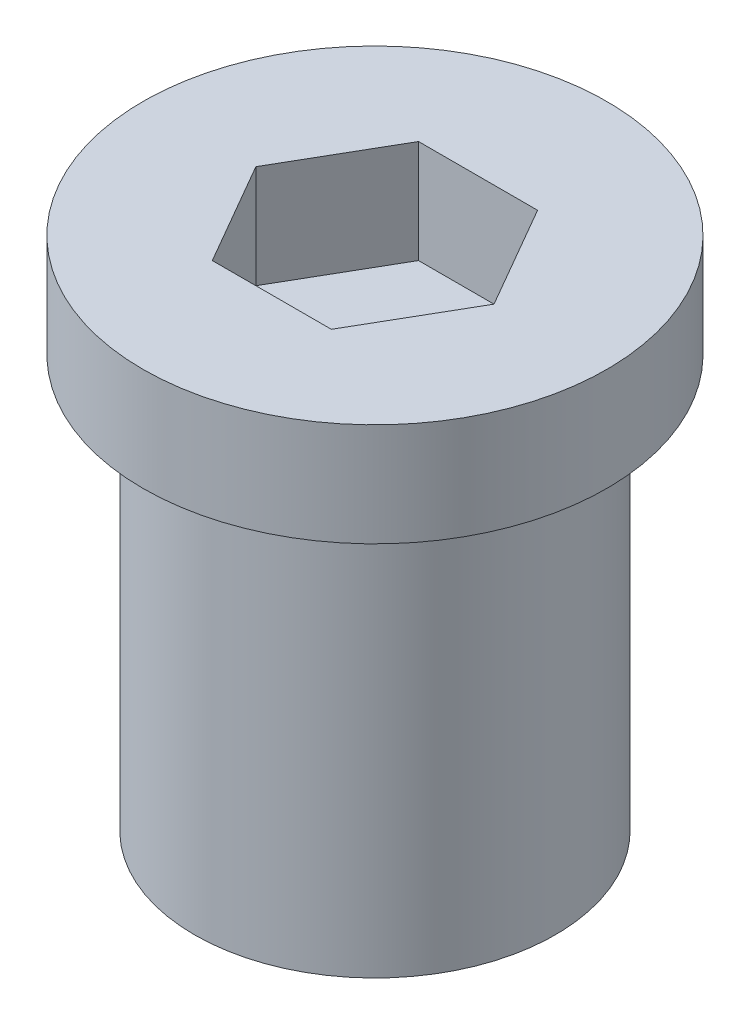
ISO-10303-21;
HEADER;
FILE_DESCRIPTION(('STEP AP214'),'2;1');
FILE_NAME('part.step','',(''),(''),'','','');
FILE_SCHEMA(('AUTOMOTIVE_DESIGN { 1 0 10303 214 1 1 1 1 }'));
ENDSEC;
DATA;
#1=APPLICATION_CONTEXT('core data for automotive mechanical design processes');
#2=APPLICATION_PROTOCOL_DEFINITION('international standard','automotive_design',2000,#1);
#3=PRODUCT_CONTEXT('',#1,'mechanical');
#4=PRODUCT('Part','Part','',(#3));
#5=PRODUCT_RELATED_PRODUCT_CATEGORY('part','',(#4));
#6=PRODUCT_DEFINITION_FORMATION('','',#4);
#7=PRODUCT_DEFINITION_CONTEXT('part definition',#1,'design');
#8=PRODUCT_DEFINITION('design','',#6,#7);
#9=PRODUCT_DEFINITION_SHAPE('','',#8);
#10=(LENGTH_UNIT() NAMED_UNIT(*) SI_UNIT(.MILLI.,.METRE.));
#11=(NAMED_UNIT(*) PLANE_ANGLE_UNIT() SI_UNIT($,.RADIAN.));
#12=(NAMED_UNIT(*) SI_UNIT($,.STERADIAN.) SOLID_ANGLE_UNIT());
#13=UNCERTAINTY_MEASURE_WITH_UNIT(LENGTH_MEASURE(1.E-05),#10,'distance_accuracy_value','');
#14=(GEOMETRIC_REPRESENTATION_CONTEXT(3) GLOBAL_UNCERTAINTY_ASSIGNED_CONTEXT((#13)) GLOBAL_UNIT_ASSIGNED_CONTEXT((#10,
#11,#12)) REPRESENTATION_CONTEXT('',''));
#15=CARTESIAN_POINT('',(0.,0.,0.));
#16=DIRECTION('',(0.,0.,1.));
#17=DIRECTION('',(1.,0.,0.));
#18=AXIS2_PLACEMENT_3D('',#15,#16,#17);
#19=CARTESIAN_POINT('',(0.,2.,0.));
#20=DIRECTION('',(0.,-1.,0.));
#21=DIRECTION('',(0.,0.,-1.));
#22=AXIS2_PLACEMENT_3D('',#19,#20,#21);
#23=CYLINDRICAL_SURFACE('',#22,1.75);
#24=CARTESIAN_POINT('',(0.,2.,0.));
#25=DIRECTION('',(0.,1.,0.));
#26=DIRECTION('',(0.,0.,1.));
#27=AXIS2_PLACEMENT_3D('',#24,#25,#26);
#28=CIRCLE('',#27,1.75);
#29=CARTESIAN_POINT('',(0.,2.,1.75));
#30=VERTEX_POINT('',#29);
#31=EDGE_CURVE('E11',#30,#30,#28,.T.);
#32=ORIENTED_EDGE('',*,*,#31,.F.);
#33=EDGE_LOOP('',(#32));
#34=FACE_BOUND('',#33,.T.);
#35=CARTESIAN_POINT('',(0.,-2.,0.));
#36=DIRECTION('',(0.,1.,0.));
#37=DIRECTION('',(0.,0.,1.));
#38=AXIS2_PLACEMENT_3D('',#35,#36,#37);
#39=CIRCLE('',#38,1.75);
#40=CARTESIAN_POINT('',(0.,-2.,1.75));
#41=VERTEX_POINT('',#40);
#42=EDGE_CURVE('E44',#41,#41,#39,.T.);
#43=ORIENTED_EDGE('',*,*,#42,.T.);
#44=EDGE_LOOP('',(#43));
#45=FACE_BOUND('',#44,.T.);
#46=ADVANCED_FACE('F41',(#34,#45),#23,.T.);
#47=CARTESIAN_POINT('',(0.,-2.,0.));
#48=DIRECTION('',(0.,1.,0.));
#49=DIRECTION('',(0.,0.,1.));
#50=AXIS2_PLACEMENT_3D('',#47,#48,#49);
#51=PLANE('',#50);
#52=ORIENTED_EDGE('',*,*,#42,.F.);
#53=EDGE_LOOP('',(#52));
#54=FACE_BOUND('',#53,.T.);
#55=ADVANCED_FACE('F173',(#54),#51,.F.);
#56=CARTESIAN_POINT('',(0.,3.,0.));
#57=DIRECTION('',(0.,-1.,0.));
#58=DIRECTION('',(0.,0.,-1.));
#59=AXIS2_PLACEMENT_3D('',#56,#57,#58);
#60=CYLINDRICAL_SURFACE('',#59,2.25);
#61=CARTESIAN_POINT('',(0.,3.,0.));
#62=DIRECTION('',(0.,1.,0.));
#63=DIRECTION('',(0.,0.,1.));
#64=AXIS2_PLACEMENT_3D('',#61,#62,#63);
#65=CIRCLE('',#64,2.25);
#66=CARTESIAN_POINT('',(0.,3.,2.25));
#67=VERTEX_POINT('',#66);
#68=EDGE_CURVE('E148',#67,#67,#65,.T.);
#69=ORIENTED_EDGE('',*,*,#68,.F.);
#70=EDGE_LOOP('',(#69));
#71=FACE_BOUND('',#70,.T.);
#72=CARTESIAN_POINT('',(0.,2.,0.));
#73=DIRECTION('',(0.,1.,0.));
#74=DIRECTION('',(0.,0.,1.));
#75=AXIS2_PLACEMENT_3D('',#72,#73,#74);
#76=CIRCLE('',#75,2.25);
#77=CARTESIAN_POINT('',(0.,2.,2.25));
#78=VERTEX_POINT('',#77);
#79=EDGE_CURVE('E142',#78,#78,#76,.T.);
#80=ORIENTED_EDGE('',*,*,#79,.T.);
#81=EDGE_LOOP('',(#80));
#82=FACE_BOUND('',#81,.T.);
#83=ADVANCED_FACE('F154',(#71,#82),#60,.T.);
#84=CARTESIAN_POINT('',(0.,3.,0.));
#85=DIRECTION('',(0.,1.,0.));
#86=DIRECTION('',(0.,0.,1.));
#87=AXIS2_PLACEMENT_3D('',#84,#85,#86);
#88=PLANE('',#87);
#89=DIRECTION('',(0.5,0.,-0.866025403784439));
#90=VECTOR('',#89,1.);
#91=CARTESIAN_POINT('',(0.577350269189626,3.,1.));
#92=LINE('',#91,#90);
#93=CARTESIAN_POINT('',(0.577350269189626,3.,1.));
#94=VERTEX_POINT('',#93);
#95=CARTESIAN_POINT('',(1.15470053837925,3.,0.));
#96=VERTEX_POINT('',#95);
#97=EDGE_CURVE('E55',#94,#96,#92,.T.);
#98=ORIENTED_EDGE('',*,*,#97,.F.);
#99=DIRECTION('',(1.,0.,0.));
#100=VECTOR('',#99,1.);
#101=CARTESIAN_POINT('',(-0.577350269189626,3.,1.));
#102=LINE('',#101,#100);
#103=CARTESIAN_POINT('',(-0.577350269189626,3.,1.));
#104=VERTEX_POINT('',#103);
#105=EDGE_CURVE('E138',#104,#94,#102,.T.);
#106=ORIENTED_EDGE('',*,*,#105,.F.);
#107=DIRECTION('',(0.5,0.,0.866025403784439));
#108=VECTOR('',#107,1.);
#109=CARTESIAN_POINT('',(-1.15470053837925,3.,0.));
#110=LINE('',#109,#108);
#111=CARTESIAN_POINT('',(-1.15470053837925,3.,0.));
#112=VERTEX_POINT('',#111);
#113=EDGE_CURVE('E136',#112,#104,#110,.T.);
#114=ORIENTED_EDGE('',*,*,#113,.F.);
#115=DIRECTION('',(-0.5,0.,0.866025403784439));
#116=VECTOR('',#115,1.);
#117=CARTESIAN_POINT('',(-0.577350269189626,3.,-1.));
#118=LINE('',#117,#116);
#119=CARTESIAN_POINT('',(-0.577350269189626,3.,-1.));
#120=VERTEX_POINT('',#119);
#121=EDGE_CURVE('E103',#120,#112,#118,.T.);
#122=ORIENTED_EDGE('',*,*,#121,.F.);
#123=DIRECTION('',(-1.,0.,0.));
#124=VECTOR('',#123,1.);
#125=CARTESIAN_POINT('',(0.577350269189626,3.,-1.));
#126=LINE('',#125,#124);
#127=CARTESIAN_POINT('',(0.577350269189626,3.,-1.));
#128=VERTEX_POINT('',#127);
#129=EDGE_CURVE('E132',#128,#120,#126,.T.);
#130=ORIENTED_EDGE('',*,*,#129,.F.);
#131=DIRECTION('',(-0.5,0.,-0.866025403784439));
#132=VECTOR('',#131,1.);
#133=CARTESIAN_POINT('',(1.15470053837925,3.,0.));
#134=LINE('',#133,#132);
#135=EDGE_CURVE('E129',#96,#128,#134,.T.);
#136=ORIENTED_EDGE('',*,*,#135,.F.);
#137=EDGE_LOOP('',(#98,#106,#114,#122,#130,#136));
#138=FACE_BOUND('',#137,.T.);
#139=ORIENTED_EDGE('',*,*,#68,.T.);
#140=EDGE_LOOP('',(#139));
#141=FACE_BOUND('',#140,.T.);
#142=ADVANCED_FACE('F159',(#138,#141),#88,.T.);
#143=CARTESIAN_POINT('',(0.,2.,0.));
#144=DIRECTION('',(0.,1.,0.));
#145=DIRECTION('',(0.,0.,1.));
#146=AXIS2_PLACEMENT_3D('',#143,#144,#145);
#147=PLANE('',#146);
#148=ORIENTED_EDGE('',*,*,#31,.T.);
#149=EDGE_LOOP('',(#148));
#150=FACE_BOUND('',#149,.T.);
#151=ORIENTED_EDGE('',*,*,#79,.F.);
#152=EDGE_LOOP('',(#151));
#153=FACE_BOUND('',#152,.T.);
#154=ADVANCED_FACE('F156',(#150,#153),#147,.F.);
#155=CARTESIAN_POINT('',(0.577350269189626,2.,1.));
#156=DIRECTION('',(0.866025403784439,0.,0.5));
#157=DIRECTION('',(0.5,0.,-0.866025403784439));
#158=AXIS2_PLACEMENT_3D('',#155,#156,#157);
#159=PLANE('',#158);
#160=ORIENTED_EDGE('',*,*,#97,.T.);
#161=DIRECTION('',(0.,1.,0.));
#162=VECTOR('',#161,1.);
#163=CARTESIAN_POINT('',(1.15470053837925,2.,0.));
#164=LINE('',#163,#162);
#165=CARTESIAN_POINT('',(1.15470053837925,2.,0.));
#166=VERTEX_POINT('',#165);
#167=EDGE_CURVE('E85',#166,#96,#164,.T.);
#168=ORIENTED_EDGE('',*,*,#167,.F.);
#169=DIRECTION('',(0.5,0.,-0.866025403784439));
#170=VECTOR('',#169,1.);
#171=CARTESIAN_POINT('',(0.577350269189626,2.,1.));
#172=LINE('',#171,#170);
#173=CARTESIAN_POINT('',(0.577350269189626,2.,1.));
#174=VERTEX_POINT('',#173);
#175=EDGE_CURVE('E140',#174,#166,#172,.T.);
#176=ORIENTED_EDGE('',*,*,#175,.F.);
#177=DIRECTION('',(0.,1.,0.));
#178=VECTOR('',#177,1.);
#179=CARTESIAN_POINT('',(0.577350269189626,2.,1.));
#180=LINE('',#179,#178);
#181=EDGE_CURVE('E63',#174,#94,#180,.T.);
#182=ORIENTED_EDGE('',*,*,#181,.T.);
#183=EDGE_LOOP('',(#160,#168,#176,#182));
#184=FACE_BOUND('',#183,.T.);
#185=ADVANCED_FACE('F158',(#184),#159,.F.);
#186=CARTESIAN_POINT('',(-0.577350269189626,2.,1.));
#187=DIRECTION('',(0.,0.,1.));
#188=DIRECTION('',(1.,0.,0.));
#189=AXIS2_PLACEMENT_3D('',#186,#187,#188);
#190=PLANE('',#189);
#191=ORIENTED_EDGE('',*,*,#105,.T.);
#192=ORIENTED_EDGE('',*,*,#181,.F.);
#193=DIRECTION('',(1.,0.,0.));
#194=VECTOR('',#193,1.);
#195=CARTESIAN_POINT('',(-0.577350269189626,2.,1.));
#196=LINE('',#195,#194);
#197=CARTESIAN_POINT('',(-0.577350269189626,2.,1.));
#198=VERTEX_POINT('',#197);
#199=EDGE_CURVE('E115',#198,#174,#196,.T.);
#200=ORIENTED_EDGE('',*,*,#199,.F.);
#201=DIRECTION('',(0.,1.,0.));
#202=VECTOR('',#201,1.);
#203=CARTESIAN_POINT('',(-0.577350269189626,2.,1.));
#204=LINE('',#203,#202);
#205=EDGE_CURVE('E107',#198,#104,#204,.T.);
#206=ORIENTED_EDGE('',*,*,#205,.T.);
#207=EDGE_LOOP('',(#191,#192,#200,#206));
#208=FACE_BOUND('',#207,.T.);
#209=ADVANCED_FACE('F167',(#208),#190,.F.);
#210=CARTESIAN_POINT('',(-1.15470053837925,2.,0.));
#211=DIRECTION('',(-0.866025403784439,0.,0.5));
#212=DIRECTION('',(0.5,0.,0.866025403784439));
#213=AXIS2_PLACEMENT_3D('',#210,#211,#212);
#214=PLANE('',#213);
#215=ORIENTED_EDGE('',*,*,#113,.T.);
#216=ORIENTED_EDGE('',*,*,#205,.F.);
#217=DIRECTION('',(0.5,0.,0.866025403784439));
#218=VECTOR('',#217,1.);
#219=CARTESIAN_POINT('',(-1.15470053837925,2.,0.));
#220=LINE('',#219,#218);
#221=CARTESIAN_POINT('',(-1.15470053837925,2.,0.));
#222=VERTEX_POINT('',#221);
#223=EDGE_CURVE('E111',#222,#198,#220,.T.);
#224=ORIENTED_EDGE('',*,*,#223,.F.);
#225=DIRECTION('',(0.,1.,0.));
#226=VECTOR('',#225,1.);
#227=CARTESIAN_POINT('',(-1.15470053837925,2.,0.));
#228=LINE('',#227,#226);
#229=EDGE_CURVE('E96',#222,#112,#228,.T.);
#230=ORIENTED_EDGE('',*,*,#229,.T.);
#231=EDGE_LOOP('',(#215,#216,#224,#230));
#232=FACE_BOUND('',#231,.T.);
#233=ADVANCED_FACE('F112',(#232),#214,.F.);
#234=CARTESIAN_POINT('',(-0.577350269189626,2.,-1.));
#235=DIRECTION('',(-0.866025403784439,0.,-0.5));
#236=DIRECTION('',(-0.5,0.,0.866025403784439));
#237=AXIS2_PLACEMENT_3D('',#234,#235,#236);
#238=PLANE('',#237);
#239=ORIENTED_EDGE('',*,*,#121,.T.);
#240=ORIENTED_EDGE('',*,*,#229,.F.);
#241=DIRECTION('',(-0.5,0.,0.866025403784439));
#242=VECTOR('',#241,1.);
#243=CARTESIAN_POINT('',(-0.577350269189626,2.,-1.));
#244=LINE('',#243,#242);
#245=CARTESIAN_POINT('',(-0.577350269189626,2.,-1.));
#246=VERTEX_POINT('',#245);
#247=EDGE_CURVE('E100',#246,#222,#244,.T.);
#248=ORIENTED_EDGE('',*,*,#247,.F.);
#249=DIRECTION('',(0.,1.,0.));
#250=VECTOR('',#249,1.);
#251=CARTESIAN_POINT('',(-0.577350269189626,2.,-1.));
#252=LINE('',#251,#250);
#253=EDGE_CURVE('E108',#246,#120,#252,.T.);
#254=ORIENTED_EDGE('',*,*,#253,.T.);
#255=EDGE_LOOP('',(#239,#240,#248,#254));
#256=FACE_BOUND('',#255,.T.);
#257=ADVANCED_FACE('F98',(#256),#238,.F.);
#258=CARTESIAN_POINT('',(0.577350269189626,2.,-1.));
#259=DIRECTION('',(0.,0.,-1.));
#260=DIRECTION('',(-1.,0.,0.));
#261=AXIS2_PLACEMENT_3D('',#258,#259,#260);
#262=PLANE('',#261);
#263=ORIENTED_EDGE('',*,*,#129,.T.);
#264=ORIENTED_EDGE('',*,*,#253,.F.);
#265=DIRECTION('',(-1.,0.,0.));
#266=VECTOR('',#265,1.);
#267=CARTESIAN_POINT('',(0.577350269189626,2.,-1.));
#268=LINE('',#267,#266);
#269=CARTESIAN_POINT('',(0.577350269189626,2.,-1.));
#270=VERTEX_POINT('',#269);
#271=EDGE_CURVE('E121',#270,#246,#268,.T.);
#272=ORIENTED_EDGE('',*,*,#271,.F.);
#273=DIRECTION('',(0.,1.,0.));
#274=VECTOR('',#273,1.);
#275=CARTESIAN_POINT('',(0.577350269189626,2.,-1.));
#276=LINE('',#275,#274);
#277=EDGE_CURVE('E145',#270,#128,#276,.T.);
#278=ORIENTED_EDGE('',*,*,#277,.T.);
#279=EDGE_LOOP('',(#263,#264,#272,#278));
#280=FACE_BOUND('',#279,.T.);
#281=ADVANCED_FACE('F235',(#280),#262,.F.);
#282=CARTESIAN_POINT('',(1.15470053837925,2.,0.));
#283=DIRECTION('',(0.866025403784439,0.,-0.5));
#284=DIRECTION('',(-0.5,0.,-0.866025403784439));
#285=AXIS2_PLACEMENT_3D('',#282,#283,#284);
#286=PLANE('',#285);
#287=ORIENTED_EDGE('',*,*,#135,.T.);
#288=ORIENTED_EDGE('',*,*,#277,.F.);
#289=DIRECTION('',(-0.5,0.,-0.866025403784439));
#290=VECTOR('',#289,1.);
#291=CARTESIAN_POINT('',(1.15470053837925,2.,0.));
#292=LINE('',#291,#290);
#293=EDGE_CURVE('E123',#166,#270,#292,.T.);
#294=ORIENTED_EDGE('',*,*,#293,.F.);
#295=ORIENTED_EDGE('',*,*,#167,.T.);
#296=EDGE_LOOP('',(#287,#288,#294,#295));
#297=FACE_BOUND('',#296,.T.);
#298=ADVANCED_FACE('F244',(#297),#286,.F.);
#299=CARTESIAN_POINT('',(0.,2.,0.));
#300=DIRECTION('',(0.,1.,0.));
#301=DIRECTION('',(0.,0.,1.));
#302=AXIS2_PLACEMENT_3D('',#299,#300,#301);
#303=PLANE('',#302);
#304=ORIENTED_EDGE('',*,*,#175,.T.);
#305=ORIENTED_EDGE('',*,*,#293,.T.);
#306=ORIENTED_EDGE('',*,*,#271,.T.);
#307=ORIENTED_EDGE('',*,*,#247,.T.);
#308=ORIENTED_EDGE('',*,*,#223,.T.);
#309=ORIENTED_EDGE('',*,*,#199,.T.);
#310=EDGE_LOOP('',(#304,#305,#306,#307,#308,#309));
#311=FACE_BOUND('',#310,.T.);
#312=ADVANCED_FACE('F118',(#311),#303,.T.);
#313=CLOSED_SHELL('',(#46,#55,#83,#142,#154,#185,#209,#233,#257,#281,#298,#312));
#314=MANIFOLD_SOLID_BREP('B2',#313);
#315=ADVANCED_BREP_SHAPE_REPRESENTATION('',(#18,#314),#14);
#316=SHAPE_DEFINITION_REPRESENTATION(#9,#315);
ENDSEC;
END-ISO-10303-21;
